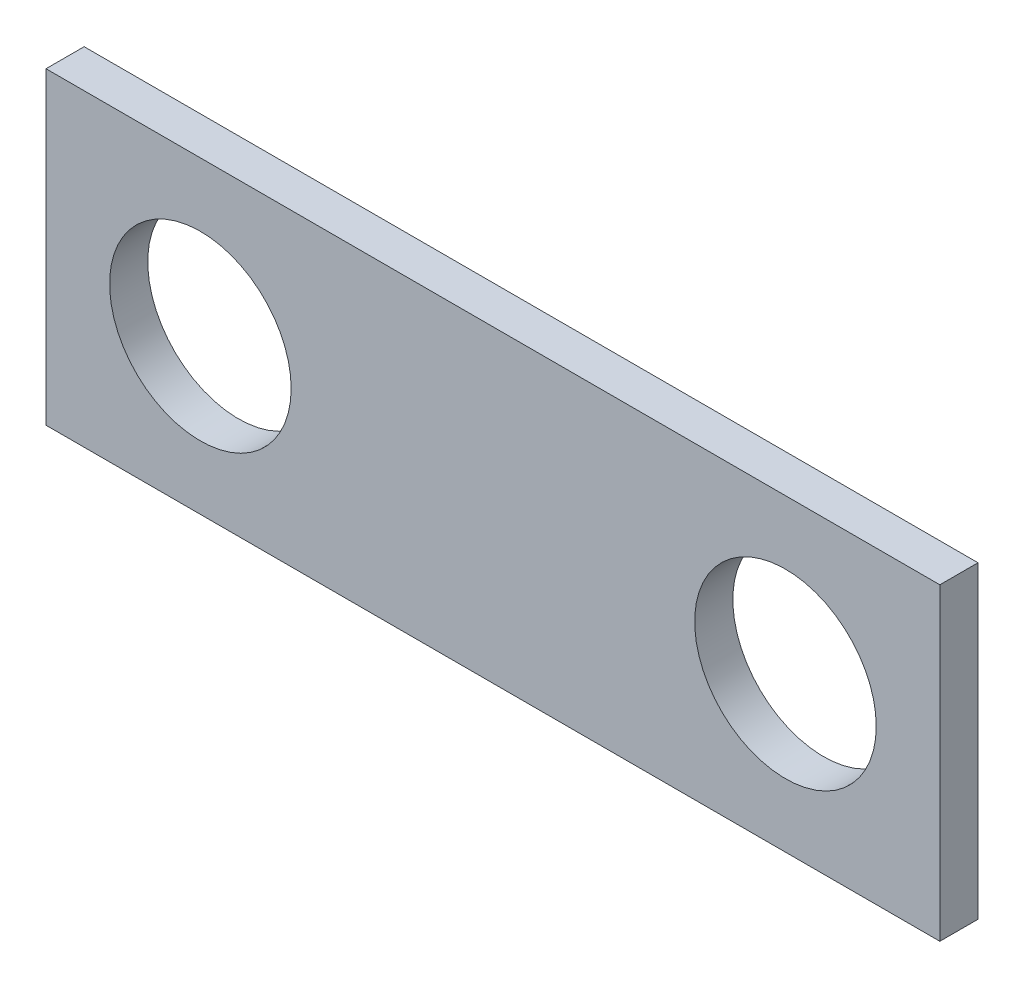
ISO-10303-21;
HEADER;
FILE_DESCRIPTION(('STEP AP214'),'2;1');
FILE_NAME('part.step','',(''),(''),'','','');
FILE_SCHEMA(('AUTOMOTIVE_DESIGN { 1 0 10303 214 1 1 1 1 }'));
ENDSEC;
DATA;
#1=APPLICATION_CONTEXT('core data for automotive mechanical design processes');
#2=APPLICATION_PROTOCOL_DEFINITION('international standard','automotive_design',2000,#1);
#3=PRODUCT_CONTEXT('',#1,'mechanical');
#4=PRODUCT('Part','Part','',(#3));
#5=PRODUCT_RELATED_PRODUCT_CATEGORY('part','',(#4));
#6=PRODUCT_DEFINITION_FORMATION('','',#4);
#7=PRODUCT_DEFINITION_CONTEXT('part definition',#1,'design');
#8=PRODUCT_DEFINITION('design','',#6,#7);
#9=PRODUCT_DEFINITION_SHAPE('','',#8);
#10=(LENGTH_UNIT() NAMED_UNIT(*) SI_UNIT(.MILLI.,.METRE.));
#11=(NAMED_UNIT(*) PLANE_ANGLE_UNIT() SI_UNIT($,.RADIAN.));
#12=(NAMED_UNIT(*) SI_UNIT($,.STERADIAN.) SOLID_ANGLE_UNIT());
#13=UNCERTAINTY_MEASURE_WITH_UNIT(LENGTH_MEASURE(1.E-05),#10,'distance_accuracy_value','');
#14=(GEOMETRIC_REPRESENTATION_CONTEXT(3) GLOBAL_UNCERTAINTY_ASSIGNED_CONTEXT((#13)) GLOBAL_UNIT_ASSIGNED_CONTEXT((#10,
#11,#12)) REPRESENTATION_CONTEXT('',''));
#15=CARTESIAN_POINT('',(0.,0.,0.));
#16=DIRECTION('',(0.,0.,1.));
#17=DIRECTION('',(1.,0.,0.));
#18=AXIS2_PLACEMENT_3D('',#15,#16,#17);
#19=CARTESIAN_POINT('',(0.,0.,6.));
#20=DIRECTION('',(0.,0.,-1.));
#21=DIRECTION('',(-1.,0.,0.));
#22=AXIS2_PLACEMENT_3D('',#19,#20,#21);
#23=PLANE('',#22);
#24=DIRECTION('',(0.,-1.,0.));
#25=VECTOR('',#24,1.);
#26=CARTESIAN_POINT('',(0.,0.,6.));
#27=LINE('',#26,#25);
#28=CARTESIAN_POINT('',(0.,48.5496,6.));
#29=VERTEX_POINT('',#28);
#30=CARTESIAN_POINT('',(0.,0.,6.));
#31=VERTEX_POINT('',#30);
#32=EDGE_CURVE('E90',#29,#31,#27,.T.);
#33=ORIENTED_EDGE('',*,*,#32,.T.);
#34=DIRECTION('',(1.,0.,0.));
#35=VECTOR('',#34,1.);
#36=CARTESIAN_POINT('',(0.,0.,6.));
#37=LINE('',#36,#35);
#38=CARTESIAN_POINT('',(140.5496,0.,6.));
#39=VERTEX_POINT('',#38);
#40=EDGE_CURVE('E85',#31,#39,#37,.T.);
#41=ORIENTED_EDGE('',*,*,#40,.T.);
#42=DIRECTION('',(0.,1.,0.));
#43=VECTOR('',#42,1.);
#44=CARTESIAN_POINT('',(140.5496,0.,6.));
#45=LINE('',#44,#43);
#46=CARTESIAN_POINT('',(140.5496,48.5496,6.));
#47=VERTEX_POINT('',#46);
#48=EDGE_CURVE('E88',#39,#47,#45,.T.);
#49=ORIENTED_EDGE('',*,*,#48,.T.);
#50=DIRECTION('',(-1.,0.,0.));
#51=VECTOR('',#50,1.);
#52=CARTESIAN_POINT('',(0.,48.5496,6.));
#53=LINE('',#52,#51);
#54=EDGE_CURVE('E55',#47,#29,#53,.T.);
#55=ORIENTED_EDGE('',*,*,#54,.T.);
#56=EDGE_LOOP('',(#33,#41,#49,#55));
#57=FACE_BOUND('',#56,.T.);
#58=CARTESIAN_POINT('',(24.2748,24.2748,6.));
#59=DIRECTION('',(0.,0.,1.));
#60=DIRECTION('',(1.,0.,0.));
#61=AXIS2_PLACEMENT_3D('',#58,#59,#60);
#62=CIRCLE('',#61,14.2748);
#63=CARTESIAN_POINT('',(38.5496,24.2748,6.));
#64=VERTEX_POINT('',#63);
#65=EDGE_CURVE('E105',#64,#64,#62,.T.);
#66=ORIENTED_EDGE('',*,*,#65,.F.);
#67=EDGE_LOOP('',(#66));
#68=FACE_BOUND('',#67,.T.);
#69=CARTESIAN_POINT('',(116.2748,24.2748,6.));
#70=DIRECTION('',(0.,0.,1.));
#71=DIRECTION('',(1.,0.,0.));
#72=AXIS2_PLACEMENT_3D('',#69,#70,#71);
#73=CIRCLE('',#72,14.2748);
#74=CARTESIAN_POINT('',(130.5496,24.2748,6.));
#75=VERTEX_POINT('',#74);
#76=EDGE_CURVE('E120',#75,#75,#73,.T.);
#77=ORIENTED_EDGE('',*,*,#76,.F.);
#78=EDGE_LOOP('',(#77));
#79=FACE_BOUND('',#78,.T.);
#80=ADVANCED_FACE('F38',(#57,#68,#79),#23,.F.);
#81=CARTESIAN_POINT('',(0.,0.,0.));
#82=DIRECTION('',(0.,0.,-1.));
#83=DIRECTION('',(-1.,0.,0.));
#84=AXIS2_PLACEMENT_3D('',#81,#82,#83);
#85=PLANE('',#84);
#86=CARTESIAN_POINT('',(24.2748,24.2748,0.));
#87=DIRECTION('',(0.,0.,1.));
#88=DIRECTION('',(1.,0.,0.));
#89=AXIS2_PLACEMENT_3D('',#86,#87,#88);
#90=CIRCLE('',#89,14.2748);
#91=CARTESIAN_POINT('',(38.5496,24.2748,0.));
#92=VERTEX_POINT('',#91);
#93=EDGE_CURVE('E117',#92,#92,#90,.T.);
#94=ORIENTED_EDGE('',*,*,#93,.T.);
#95=EDGE_LOOP('',(#94));
#96=FACE_BOUND('',#95,.T.);
#97=DIRECTION('',(0.,-1.,0.));
#98=VECTOR('',#97,1.);
#99=CARTESIAN_POINT('',(0.,0.,0.));
#100=LINE('',#99,#98);
#101=CARTESIAN_POINT('',(0.,48.5496,0.));
#102=VERTEX_POINT('',#101);
#103=CARTESIAN_POINT('',(0.,0.,0.));
#104=VERTEX_POINT('',#103);
#105=EDGE_CURVE('E102',#102,#104,#100,.T.);
#106=ORIENTED_EDGE('',*,*,#105,.F.);
#107=DIRECTION('',(-1.,0.,0.));
#108=VECTOR('',#107,1.);
#109=CARTESIAN_POINT('',(0.,48.5496,0.));
#110=LINE('',#109,#108);
#111=CARTESIAN_POINT('',(140.5496,48.5496,0.));
#112=VERTEX_POINT('',#111);
#113=EDGE_CURVE('E78',#112,#102,#110,.T.);
#114=ORIENTED_EDGE('',*,*,#113,.F.);
#115=DIRECTION('',(0.,1.,0.));
#116=VECTOR('',#115,1.);
#117=CARTESIAN_POINT('',(140.5496,0.,0.));
#118=LINE('',#117,#116);
#119=CARTESIAN_POINT('',(140.5496,0.,0.));
#120=VERTEX_POINT('',#119);
#121=EDGE_CURVE('E72',#120,#112,#118,.T.);
#122=ORIENTED_EDGE('',*,*,#121,.F.);
#123=DIRECTION('',(1.,0.,0.));
#124=VECTOR('',#123,1.);
#125=CARTESIAN_POINT('',(0.,0.,0.));
#126=LINE('',#125,#124);
#127=EDGE_CURVE('E94',#104,#120,#126,.T.);
#128=ORIENTED_EDGE('',*,*,#127,.F.);
#129=EDGE_LOOP('',(#106,#114,#122,#128));
#130=FACE_BOUND('',#129,.T.);
#131=CARTESIAN_POINT('',(116.2748,24.2748,0.));
#132=DIRECTION('',(0.,0.,1.));
#133=DIRECTION('',(1.,0.,0.));
#134=AXIS2_PLACEMENT_3D('',#131,#132,#133);
#135=CIRCLE('',#134,14.2748);
#136=CARTESIAN_POINT('',(130.5496,24.2748,0.));
#137=VERTEX_POINT('',#136);
#138=EDGE_CURVE('E123',#137,#137,#135,.T.);
#139=ORIENTED_EDGE('',*,*,#138,.T.);
#140=EDGE_LOOP('',(#139));
#141=FACE_BOUND('',#140,.T.);
#142=ADVANCED_FACE('F113',(#96,#130,#141),#85,.T.);
#143=CARTESIAN_POINT('',(0.,0.,6.));
#144=DIRECTION('',(1.,0.,0.));
#145=DIRECTION('',(0.,0.,-1.));
#146=AXIS2_PLACEMENT_3D('',#143,#144,#145);
#147=PLANE('',#146);
#148=ORIENTED_EDGE('',*,*,#105,.T.);
#149=DIRECTION('',(0.,0.,-1.));
#150=VECTOR('',#149,1.);
#151=CARTESIAN_POINT('',(0.,0.,6.));
#152=LINE('',#151,#150);
#153=EDGE_CURVE('E11',#31,#104,#152,.T.);
#154=ORIENTED_EDGE('',*,*,#153,.F.);
#155=ORIENTED_EDGE('',*,*,#32,.F.);
#156=DIRECTION('',(0.,0.,-1.));
#157=VECTOR('',#156,1.);
#158=CARTESIAN_POINT('',(0.,48.5496,6.));
#159=LINE('',#158,#157);
#160=EDGE_CURVE('E98',#29,#102,#159,.T.);
#161=ORIENTED_EDGE('',*,*,#160,.T.);
#162=EDGE_LOOP('',(#148,#154,#155,#161));
#163=FACE_BOUND('',#162,.T.);
#164=ADVANCED_FACE('F40',(#163),#147,.F.);
#165=CARTESIAN_POINT('',(0.,0.,6.));
#166=DIRECTION('',(0.,1.,0.));
#167=DIRECTION('',(0.,0.,1.));
#168=AXIS2_PLACEMENT_3D('',#165,#166,#167);
#169=PLANE('',#168);
#170=ORIENTED_EDGE('',*,*,#127,.T.);
#171=DIRECTION('',(0.,0.,-1.));
#172=VECTOR('',#171,1.);
#173=CARTESIAN_POINT('',(140.5496,0.,6.));
#174=LINE('',#173,#172);
#175=EDGE_CURVE('E47',#39,#120,#174,.T.);
#176=ORIENTED_EDGE('',*,*,#175,.F.);
#177=ORIENTED_EDGE('',*,*,#40,.F.);
#178=ORIENTED_EDGE('',*,*,#153,.T.);
#179=EDGE_LOOP('',(#170,#176,#177,#178));
#180=FACE_BOUND('',#179,.T.);
#181=ADVANCED_FACE('F93',(#180),#169,.F.);
#182=CARTESIAN_POINT('',(140.5496,0.,6.));
#183=DIRECTION('',(-1.,0.,0.));
#184=DIRECTION('',(0.,0.,1.));
#185=AXIS2_PLACEMENT_3D('',#182,#183,#184);
#186=PLANE('',#185);
#187=ORIENTED_EDGE('',*,*,#121,.T.);
#188=DIRECTION('',(0.,0.,-1.));
#189=VECTOR('',#188,1.);
#190=CARTESIAN_POINT('',(140.5496,48.5496,6.));
#191=LINE('',#190,#189);
#192=EDGE_CURVE('E95',#47,#112,#191,.T.);
#193=ORIENTED_EDGE('',*,*,#192,.F.);
#194=ORIENTED_EDGE('',*,*,#48,.F.);
#195=ORIENTED_EDGE('',*,*,#175,.T.);
#196=EDGE_LOOP('',(#187,#193,#194,#195));
#197=FACE_BOUND('',#196,.T.);
#198=ADVANCED_FACE('F96',(#197),#186,.F.);
#199=CARTESIAN_POINT('',(0.,48.5496,6.));
#200=DIRECTION('',(0.,-1.,0.));
#201=DIRECTION('',(1.,0.,0.));
#202=AXIS2_PLACEMENT_3D('',#199,#200,#201);
#203=PLANE('',#202);
#204=ORIENTED_EDGE('',*,*,#113,.T.);
#205=ORIENTED_EDGE('',*,*,#160,.F.);
#206=ORIENTED_EDGE('',*,*,#54,.F.);
#207=ORIENTED_EDGE('',*,*,#192,.T.);
#208=EDGE_LOOP('',(#204,#205,#206,#207));
#209=FACE_BOUND('',#208,.T.);
#210=ADVANCED_FACE('F110',(#209),#203,.F.);
#211=CARTESIAN_POINT('',(24.2748,24.2748,6.));
#212=DIRECTION('',(0.,0.,-1.));
#213=DIRECTION('',(-1.,0.,0.));
#214=AXIS2_PLACEMENT_3D('',#211,#212,#213);
#215=CYLINDRICAL_SURFACE('',#214,14.2748);
#216=ORIENTED_EDGE('',*,*,#65,.T.);
#217=EDGE_LOOP('',(#216));
#218=FACE_BOUND('',#217,.T.);
#219=ORIENTED_EDGE('',*,*,#93,.F.);
#220=EDGE_LOOP('',(#219));
#221=FACE_BOUND('',#220,.T.);
#222=ADVANCED_FACE('F140',(#218,#221),#215,.F.);
#223=CARTESIAN_POINT('',(116.2748,24.2748,6.));
#224=DIRECTION('',(0.,0.,-1.));
#225=DIRECTION('',(-1.,0.,0.));
#226=AXIS2_PLACEMENT_3D('',#223,#224,#225);
#227=CYLINDRICAL_SURFACE('',#226,14.2748);
#228=ORIENTED_EDGE('',*,*,#76,.T.);
#229=EDGE_LOOP('',(#228));
#230=FACE_BOUND('',#229,.T.);
#231=ORIENTED_EDGE('',*,*,#138,.F.);
#232=EDGE_LOOP('',(#231));
#233=FACE_BOUND('',#232,.T.);
#234=ADVANCED_FACE('F129',(#230,#233),#227,.F.);
#235=CLOSED_SHELL('',(#80,#142,#164,#181,#198,#210,#222,#234));
#236=MANIFOLD_SOLID_BREP('B2',#235);
#237=ADVANCED_BREP_SHAPE_REPRESENTATION('',(#18,#236),#14);
#238=SHAPE_DEFINITION_REPRESENTATION(#9,#237);
ENDSEC;
END-ISO-10303-21;
